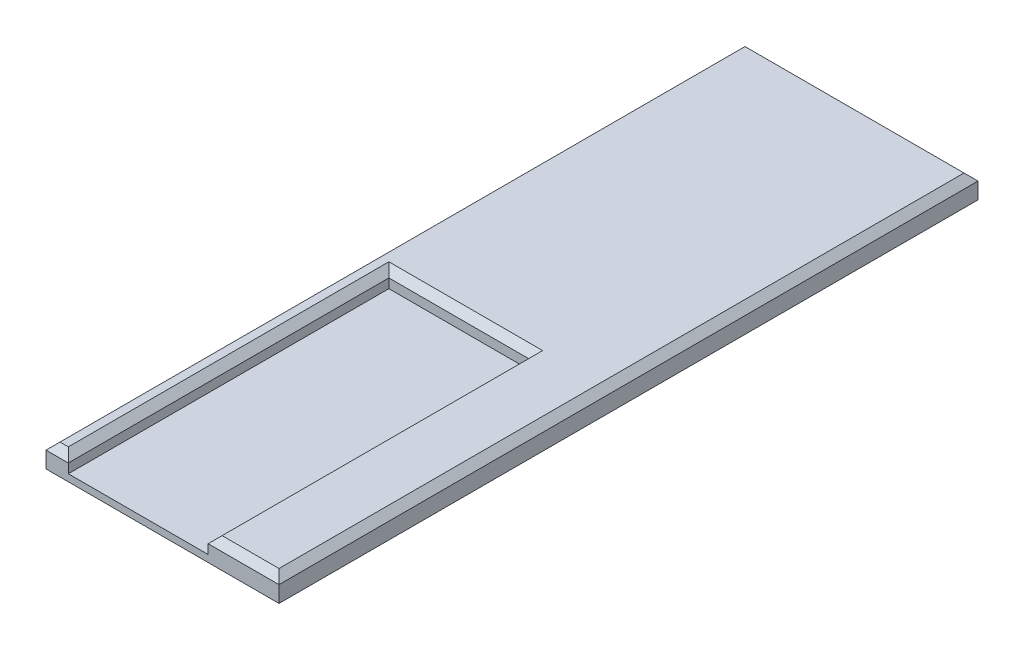
ISO-10303-21;
HEADER;
FILE_DESCRIPTION(('STEP AP214'),'2;1');
FILE_NAME('part.step','',(''),(''),'','','');
FILE_SCHEMA(('AUTOMOTIVE_DESIGN { 1 0 10303 214 1 1 1 1 }'));
ENDSEC;
DATA;
#1=APPLICATION_CONTEXT('core data for automotive mechanical design processes');
#2=APPLICATION_PROTOCOL_DEFINITION('international standard','automotive_design',2000,#1);
#3=PRODUCT_CONTEXT('',#1,'mechanical');
#4=PRODUCT('Part','Part','',(#3));
#5=PRODUCT_RELATED_PRODUCT_CATEGORY('part','',(#4));
#6=PRODUCT_DEFINITION_FORMATION('','',#4);
#7=PRODUCT_DEFINITION_CONTEXT('part definition',#1,'design');
#8=PRODUCT_DEFINITION('design','',#6,#7);
#9=PRODUCT_DEFINITION_SHAPE('','',#8);
#10=(LENGTH_UNIT() NAMED_UNIT(*) SI_UNIT(.MILLI.,.METRE.));
#11=(NAMED_UNIT(*) PLANE_ANGLE_UNIT() SI_UNIT($,.RADIAN.));
#12=(NAMED_UNIT(*) SI_UNIT($,.STERADIAN.) SOLID_ANGLE_UNIT());
#13=UNCERTAINTY_MEASURE_WITH_UNIT(LENGTH_MEASURE(1.E-05),#10,'distance_accuracy_value','');
#14=(GEOMETRIC_REPRESENTATION_CONTEXT(3) GLOBAL_UNCERTAINTY_ASSIGNED_CONTEXT((#13)) GLOBAL_UNIT_ASSIGNED_CONTEXT((#10,
#11,#12)) REPRESENTATION_CONTEXT('',''));
#15=CARTESIAN_POINT('',(0.,0.,0.));
#16=DIRECTION('',(0.,0.,1.));
#17=DIRECTION('',(1.,0.,0.));
#18=AXIS2_PLACEMENT_3D('',#15,#16,#17);
#19=CARTESIAN_POINT('',(-50.,-10.,150.));
#20=DIRECTION('',(-1.,0.,0.));
#21=DIRECTION('',(0.,0.,1.));
#22=AXIS2_PLACEMENT_3D('',#19,#20,#21);
#23=PLANE('',#22);
#24=DIRECTION('',(0.,1.,0.));
#25=VECTOR('',#24,1.);
#26=CARTESIAN_POINT('',(-50.,-10.,150.));
#27=LINE('',#26,#25);
#28=CARTESIAN_POINT('',(-50.,-10.,150.));
#29=VERTEX_POINT('',#28);
#30=CARTESIAN_POINT('',(-50.,-3.,150.));
#31=VERTEX_POINT('',#30);
#32=EDGE_CURVE('E172',#29,#31,#27,.T.);
#33=ORIENTED_EDGE('',*,*,#32,.T.);
#34=DIRECTION('',(0.,0.,-1.));
#35=VECTOR('',#34,1.);
#36=CARTESIAN_POINT('',(-50.,-3.,150.));
#37=LINE('',#36,#35);
#38=CARTESIAN_POINT('',(-50.,-3.,-150.));
#39=VERTEX_POINT('',#38);
#40=EDGE_CURVE('E46',#31,#39,#37,.T.);
#41=ORIENTED_EDGE('',*,*,#40,.T.);
#42=DIRECTION('',(0.,1.,0.));
#43=VECTOR('',#42,1.);
#44=CARTESIAN_POINT('',(-50.,-10.,-150.));
#45=LINE('',#44,#43);
#46=CARTESIAN_POINT('',(-50.,-10.,-150.));
#47=VERTEX_POINT('',#46);
#48=EDGE_CURVE('E173',#47,#39,#45,.T.);
#49=ORIENTED_EDGE('',*,*,#48,.F.);
#50=DIRECTION('',(0.,0.,1.));
#51=VECTOR('',#50,1.);
#52=CARTESIAN_POINT('',(-50.,-10.,150.));
#53=LINE('',#52,#51);
#54=EDGE_CURVE('E159',#47,#29,#53,.T.);
#55=ORIENTED_EDGE('',*,*,#54,.T.);
#56=EDGE_LOOP('',(#33,#41,#49,#55));
#57=FACE_BOUND('',#56,.T.);
#58=ADVANCED_FACE('F36',(#57),#23,.T.);
#59=CARTESIAN_POINT('',(50.,-10.,-150.));
#60=DIRECTION('',(0.,0.,-1.));
#61=DIRECTION('',(-1.,0.,0.));
#62=AXIS2_PLACEMENT_3D('',#59,#60,#61);
#63=PLANE('',#62);
#64=ORIENTED_EDGE('',*,*,#48,.T.);
#65=DIRECTION('',(1.,0.,0.));
#66=VECTOR('',#65,1.);
#67=CARTESIAN_POINT('',(50.,-3.,-150.));
#68=LINE('',#67,#66);
#69=CARTESIAN_POINT('',(50.,-3.,-150.));
#70=VERTEX_POINT('',#69);
#71=EDGE_CURVE('E11',#39,#70,#68,.T.);
#72=ORIENTED_EDGE('',*,*,#71,.T.);
#73=DIRECTION('',(0.,1.,0.));
#74=VECTOR('',#73,1.);
#75=CARTESIAN_POINT('',(50.,-10.,-150.));
#76=LINE('',#75,#74);
#77=CARTESIAN_POINT('',(50.,-10.,-150.));
#78=VERTEX_POINT('',#77);
#79=EDGE_CURVE('E176',#78,#70,#76,.T.);
#80=ORIENTED_EDGE('',*,*,#79,.F.);
#81=DIRECTION('',(-1.,0.,0.));
#82=VECTOR('',#81,1.);
#83=CARTESIAN_POINT('',(50.,-10.,-150.));
#84=LINE('',#83,#82);
#85=EDGE_CURVE('E169',#78,#47,#84,.T.);
#86=ORIENTED_EDGE('',*,*,#85,.T.);
#87=EDGE_LOOP('',(#64,#72,#80,#86));
#88=FACE_BOUND('',#87,.T.);
#89=ADVANCED_FACE('F255',(#88),#63,.T.);
#90=CARTESIAN_POINT('',(50.,-10.,150.));
#91=DIRECTION('',(1.,0.,0.));
#92=DIRECTION('',(0.,0.,-1.));
#93=AXIS2_PLACEMENT_3D('',#90,#91,#92);
#94=PLANE('',#93);
#95=ORIENTED_EDGE('',*,*,#79,.T.);
#96=DIRECTION('',(0.,0.,1.));
#97=VECTOR('',#96,1.);
#98=CARTESIAN_POINT('',(50.,-3.,150.));
#99=LINE('',#98,#97);
#100=CARTESIAN_POINT('',(50.,-3.,150.));
#101=VERTEX_POINT('',#100);
#102=EDGE_CURVE('E198',#70,#101,#99,.T.);
#103=ORIENTED_EDGE('',*,*,#102,.T.);
#104=DIRECTION('',(0.,1.,0.));
#105=VECTOR('',#104,1.);
#106=CARTESIAN_POINT('',(50.,-10.,150.));
#107=LINE('',#106,#105);
#108=CARTESIAN_POINT('',(50.,-10.,150.));
#109=VERTEX_POINT('',#108);
#110=EDGE_CURVE('E179',#109,#101,#107,.T.);
#111=ORIENTED_EDGE('',*,*,#110,.F.);
#112=DIRECTION('',(0.,0.,-1.));
#113=VECTOR('',#112,1.);
#114=CARTESIAN_POINT('',(50.,-10.,150.));
#115=LINE('',#114,#113);
#116=EDGE_CURVE('E166',#109,#78,#115,.T.);
#117=ORIENTED_EDGE('',*,*,#116,.T.);
#118=EDGE_LOOP('',(#95,#103,#111,#117));
#119=FACE_BOUND('',#118,.T.);
#120=ADVANCED_FACE('F260',(#119),#94,.T.);
#121=CARTESIAN_POINT('',(50.,-10.,150.));
#122=DIRECTION('',(0.,0.,1.));
#123=DIRECTION('',(1.,0.,0.));
#124=AXIS2_PLACEMENT_3D('',#121,#122,#123);
#125=PLANE('',#124);
#126=ORIENTED_EDGE('',*,*,#110,.T.);
#127=DIRECTION('',(-1.,0.,0.));
#128=VECTOR('',#127,1.);
#129=CARTESIAN_POINT('',(50.,-3.,150.));
#130=LINE('',#129,#128);
#131=CARTESIAN_POINT('',(19.5825318432793,-3.,150.));
#132=VERTEX_POINT('',#131);
#133=EDGE_CURVE('E152',#101,#132,#130,.T.);
#134=ORIENTED_EDGE('',*,*,#133,.T.);
#135=DIRECTION('',(0.,1.,0.));
#136=VECTOR('',#135,1.);
#137=CARTESIAN_POINT('',(19.5825318432793,-7.,150.));
#138=LINE('',#137,#136);
#139=CARTESIAN_POINT('',(19.5825318432793,-7.,150.));
#140=VERTEX_POINT('',#139);
#141=EDGE_CURVE('E132',#140,#132,#138,.T.);
#142=ORIENTED_EDGE('',*,*,#141,.F.);
#143=DIRECTION('',(1.,0.,0.));
#144=VECTOR('',#143,1.);
#145=CARTESIAN_POINT('',(19.5825318432793,-7.,150.));
#146=LINE('',#145,#144);
#147=CARTESIAN_POINT('',(-40.4174681567207,-7.,150.));
#148=VERTEX_POINT('',#147);
#149=EDGE_CURVE('E139',#148,#140,#146,.T.);
#150=ORIENTED_EDGE('',*,*,#149,.F.);
#151=DIRECTION('',(0.,1.,0.));
#152=VECTOR('',#151,1.);
#153=CARTESIAN_POINT('',(-40.4174681567207,-7.,150.));
#154=LINE('',#153,#152);
#155=CARTESIAN_POINT('',(-40.4174681567207,-3.,150.));
#156=VERTEX_POINT('',#155);
#157=EDGE_CURVE('E163',#148,#156,#154,.T.);
#158=ORIENTED_EDGE('',*,*,#157,.T.);
#159=DIRECTION('',(-1.,0.,0.));
#160=VECTOR('',#159,1.);
#161=CARTESIAN_POINT('',(50.,-3.,150.));
#162=LINE('',#161,#160);
#163=EDGE_CURVE('E201',#156,#31,#162,.T.);
#164=ORIENTED_EDGE('',*,*,#163,.T.);
#165=ORIENTED_EDGE('',*,*,#32,.F.);
#166=DIRECTION('',(1.,0.,0.));
#167=VECTOR('',#166,1.);
#168=CARTESIAN_POINT('',(50.,-10.,150.));
#169=LINE('',#168,#167);
#170=EDGE_CURVE('E162',#29,#109,#169,.T.);
#171=ORIENTED_EDGE('',*,*,#170,.T.);
#172=EDGE_LOOP('',(#126,#134,#142,#150,#158,#164,#165,#171));
#173=FACE_BOUND('',#172,.T.);
#174=ADVANCED_FACE('F150',(#173),#125,.T.);
#175=CARTESIAN_POINT('',(0.,-10.,0.));
#176=DIRECTION('',(0.,1.,0.));
#177=DIRECTION('',(0.,0.,1.));
#178=AXIS2_PLACEMENT_3D('',#175,#176,#177);
#179=PLANE('',#178);
#180=ORIENTED_EDGE('',*,*,#54,.F.);
#181=ORIENTED_EDGE('',*,*,#85,.F.);
#182=ORIENTED_EDGE('',*,*,#116,.F.);
#183=ORIENTED_EDGE('',*,*,#170,.F.);
#184=EDGE_LOOP('',(#180,#181,#182,#183));
#185=FACE_BOUND('',#184,.T.);
#186=ADVANCED_FACE('F389',(#185),#179,.F.);
#187=CARTESIAN_POINT('',(0.,0.,0.));
#188=DIRECTION('',(0.,1.,0.));
#189=DIRECTION('',(0.,0.,1.));
#190=AXIS2_PLACEMENT_3D('',#187,#188,#189);
#191=PLANE('',#190);
#192=DIRECTION('',(1.,0.,0.));
#193=VECTOR('',#192,1.);
#194=CARTESIAN_POINT('',(0.,0.,147.));
#195=LINE('',#194,#193);
#196=CARTESIAN_POINT('',(22.5825318432793,0.,147.));
#197=VERTEX_POINT('',#196);
#198=CARTESIAN_POINT('',(47.,0.,147.));
#199=VERTEX_POINT('',#198);
#200=EDGE_CURVE('E193',#197,#199,#195,.T.);
#201=ORIENTED_EDGE('',*,*,#200,.T.);
#202=DIRECTION('',(0.,0.,-1.));
#203=VECTOR('',#202,1.);
#204=CARTESIAN_POINT('',(47.,0.,0.));
#205=LINE('',#204,#203);
#206=CARTESIAN_POINT('',(47.,0.,-147.));
#207=VERTEX_POINT('',#206);
#208=EDGE_CURVE('E195',#199,#207,#205,.T.);
#209=ORIENTED_EDGE('',*,*,#208,.T.);
#210=DIRECTION('',(-1.,0.,0.));
#211=VECTOR('',#210,1.);
#212=CARTESIAN_POINT('',(0.,0.,-147.));
#213=LINE('',#212,#211);
#214=CARTESIAN_POINT('',(-47.,0.,-147.));
#215=VERTEX_POINT('',#214);
#216=EDGE_CURVE('E175',#207,#215,#213,.T.);
#217=ORIENTED_EDGE('',*,*,#216,.T.);
#218=DIRECTION('',(0.,0.,1.));
#219=VECTOR('',#218,1.);
#220=CARTESIAN_POINT('',(-47.,0.,0.));
#221=LINE('',#220,#219);
#222=CARTESIAN_POINT('',(-47.,0.,147.));
#223=VERTEX_POINT('',#222);
#224=EDGE_CURVE('E183',#215,#223,#221,.T.);
#225=ORIENTED_EDGE('',*,*,#224,.T.);
#226=DIRECTION('',(1.,0.,0.));
#227=VECTOR('',#226,1.);
#228=CARTESIAN_POINT('',(0.,0.,147.));
#229=LINE('',#228,#227);
#230=CARTESIAN_POINT('',(-43.4174681567207,0.,147.));
#231=VERTEX_POINT('',#230);
#232=EDGE_CURVE('E185',#223,#231,#229,.T.);
#233=ORIENTED_EDGE('',*,*,#232,.T.);
#234=DIRECTION('',(0.,0.,-1.));
#235=VECTOR('',#234,1.);
#236=CARTESIAN_POINT('',(-43.4174681567207,0.,12.4282527532102));
#237=LINE('',#236,#235);
#238=CARTESIAN_POINT('',(-43.4174681567207,0.,9.42825275321024));
#239=VERTEX_POINT('',#238);
#240=EDGE_CURVE('E187',#231,#239,#237,.T.);
#241=ORIENTED_EDGE('',*,*,#240,.T.);
#242=DIRECTION('',(1.,0.,0.));
#243=VECTOR('',#242,1.);
#244=CARTESIAN_POINT('',(19.5825318432793,0.,9.42825275321024));
#245=LINE('',#244,#243);
#246=CARTESIAN_POINT('',(22.5825318432793,0.,9.42825275321024));
#247=VERTEX_POINT('',#246);
#248=EDGE_CURVE('E189',#239,#247,#245,.T.);
#249=ORIENTED_EDGE('',*,*,#248,.T.);
#250=DIRECTION('',(0.,0.,1.));
#251=VECTOR('',#250,1.);
#252=CARTESIAN_POINT('',(22.5825318432793,0.,150.));
#253=LINE('',#252,#251);
#254=EDGE_CURVE('E191',#247,#197,#253,.T.);
#255=ORIENTED_EDGE('',*,*,#254,.T.);
#256=EDGE_LOOP('',(#201,#209,#217,#225,#233,#241,#249,#255));
#257=FACE_BOUND('',#256,.T.);
#258=ADVANCED_FACE('F252',(#257),#191,.T.);
#259=CARTESIAN_POINT('',(-40.4174681567207,-7.,150.));
#260=DIRECTION('',(-1.,0.,0.));
#261=DIRECTION('',(0.,0.,1.));
#262=AXIS2_PLACEMENT_3D('',#259,#260,#261);
#263=PLANE('',#262);
#264=DIRECTION('',(0.,1.,0.));
#265=VECTOR('',#264,1.);
#266=CARTESIAN_POINT('',(-40.4174681567207,-7.,12.4282527532102));
#267=LINE('',#266,#265);
#268=CARTESIAN_POINT('',(-40.4174681567207,-7.,12.4282527532102));
#269=VERTEX_POINT('',#268);
#270=CARTESIAN_POINT('',(-40.4174681567207,-3.,12.4282527532102));
#271=VERTEX_POINT('',#270);
#272=EDGE_CURVE('E154',#269,#271,#267,.T.);
#273=ORIENTED_EDGE('',*,*,#272,.T.);
#274=DIRECTION('',(0.,0.,1.));
#275=VECTOR('',#274,1.);
#276=CARTESIAN_POINT('',(-40.4174681567207,-3.,150.));
#277=LINE('',#276,#275);
#278=EDGE_CURVE('E207',#271,#156,#277,.T.);
#279=ORIENTED_EDGE('',*,*,#278,.T.);
#280=ORIENTED_EDGE('',*,*,#157,.F.);
#281=DIRECTION('',(0.,0.,1.));
#282=VECTOR('',#281,1.);
#283=CARTESIAN_POINT('',(-40.4174681567207,-7.,150.));
#284=LINE('',#283,#282);
#285=EDGE_CURVE('E145',#269,#148,#284,.T.);
#286=ORIENTED_EDGE('',*,*,#285,.F.);
#287=EDGE_LOOP('',(#273,#279,#280,#286));
#288=FACE_BOUND('',#287,.T.);
#289=ADVANCED_FACE('F241',(#288),#263,.F.);
#290=CARTESIAN_POINT('',(-40.4174681567207,-7.,12.4282527532102));
#291=DIRECTION('',(0.,0.,-1.));
#292=DIRECTION('',(-1.,0.,0.));
#293=AXIS2_PLACEMENT_3D('',#290,#291,#292);
#294=PLANE('',#293);
#295=DIRECTION('',(0.,1.,0.));
#296=VECTOR('',#295,1.);
#297=CARTESIAN_POINT('',(19.5825318432793,-7.,12.4282527532102));
#298=LINE('',#297,#296);
#299=CARTESIAN_POINT('',(19.5825318432793,-7.,12.4282527532102));
#300=VERTEX_POINT('',#299);
#301=CARTESIAN_POINT('',(19.5825318432793,-3.,12.4282527532102));
#302=VERTEX_POINT('',#301);
#303=EDGE_CURVE('E134',#300,#302,#298,.T.);
#304=ORIENTED_EDGE('',*,*,#303,.T.);
#305=DIRECTION('',(-1.,0.,0.));
#306=VECTOR('',#305,1.);
#307=CARTESIAN_POINT('',(-40.4174681567207,-3.,12.4282527532102));
#308=LINE('',#307,#306);
#309=EDGE_CURVE('E61',#302,#271,#308,.T.);
#310=ORIENTED_EDGE('',*,*,#309,.T.);
#311=ORIENTED_EDGE('',*,*,#272,.F.);
#312=DIRECTION('',(-1.,0.,0.));
#313=VECTOR('',#312,1.);
#314=CARTESIAN_POINT('',(-40.4174681567207,-7.,12.4282527532102));
#315=LINE('',#314,#313);
#316=EDGE_CURVE('E138',#300,#269,#315,.T.);
#317=ORIENTED_EDGE('',*,*,#316,.F.);
#318=EDGE_LOOP('',(#304,#310,#311,#317));
#319=FACE_BOUND('',#318,.T.);
#320=ADVANCED_FACE('F244',(#319),#294,.F.);
#321=CARTESIAN_POINT('',(19.5825318432793,-7.,12.4282527532102));
#322=DIRECTION('',(1.,0.,0.));
#323=DIRECTION('',(0.,0.,-1.));
#324=AXIS2_PLACEMENT_3D('',#321,#322,#323);
#325=PLANE('',#324);
#326=ORIENTED_EDGE('',*,*,#141,.T.);
#327=DIRECTION('',(0.,0.,-1.));
#328=VECTOR('',#327,1.);
#329=CARTESIAN_POINT('',(19.5825318432793,-3.,12.4282527532102));
#330=LINE('',#329,#328);
#331=EDGE_CURVE('E204',#132,#302,#330,.T.);
#332=ORIENTED_EDGE('',*,*,#331,.T.);
#333=ORIENTED_EDGE('',*,*,#303,.F.);
#334=DIRECTION('',(0.,0.,-1.));
#335=VECTOR('',#334,1.);
#336=CARTESIAN_POINT('',(19.5825318432793,-7.,12.4282527532102));
#337=LINE('',#336,#335);
#338=EDGE_CURVE('E128',#140,#300,#337,.T.);
#339=ORIENTED_EDGE('',*,*,#338,.F.);
#340=EDGE_LOOP('',(#326,#332,#333,#339));
#341=FACE_BOUND('',#340,.T.);
#342=ADVANCED_FACE('F130',(#341),#325,.F.);
#343=CARTESIAN_POINT('',(0.,-7.,0.));
#344=DIRECTION('',(0.,-1.,0.));
#345=DIRECTION('',(0.,0.,-1.));
#346=AXIS2_PLACEMENT_3D('',#343,#344,#345);
#347=PLANE('',#346);
#348=ORIENTED_EDGE('',*,*,#149,.T.);
#349=ORIENTED_EDGE('',*,*,#338,.T.);
#350=ORIENTED_EDGE('',*,*,#316,.T.);
#351=ORIENTED_EDGE('',*,*,#285,.T.);
#352=EDGE_LOOP('',(#348,#349,#350,#351));
#353=FACE_BOUND('',#352,.T.);
#354=ADVANCED_FACE('F143',(#353),#347,.F.);
#355=CARTESIAN_POINT('',(-40.4174681567207,-3.,150.));
#356=DIRECTION('',(0.707106781186547,0.707106781186547,0.));
#357=DIRECTION('',(0.,0.,-1.));
#358=AXIS2_PLACEMENT_3D('',#355,#356,#357);
#359=PLANE('',#358);
#360=DIRECTION('',(0.577350269189626,-0.577350269189626,0.577350269189626));
#361=VECTOR('',#360,1.);
#362=CARTESIAN_POINT('',(-28.9449787711471,-14.4724893855736,161.472489385574));
#363=LINE('',#362,#361);
#364=EDGE_CURVE('E225',#156,#231,#363,.F.);
#365=ORIENTED_EDGE('',*,*,#364,.F.);
#366=ORIENTED_EDGE('',*,*,#278,.F.);
#367=DIRECTION('',(-0.577350269189626,0.577350269189626,-0.577350269189626));
#368=VECTOR('',#367,1.);
#369=CARTESIAN_POINT('',(-40.4174681567207,-3.,12.4282527532102));
#370=LINE('',#369,#368);
#371=EDGE_CURVE('E41',#239,#271,#370,.F.);
#372=ORIENTED_EDGE('',*,*,#371,.F.);
#373=ORIENTED_EDGE('',*,*,#240,.F.);
#374=EDGE_LOOP('',(#365,#366,#372,#373));
#375=FACE_BOUND('',#374,.T.);
#376=ADVANCED_FACE('F39',(#375),#359,.T.);
#377=CARTESIAN_POINT('',(-40.4174681567207,-3.,12.4282527532102));
#378=DIRECTION('',(0.,0.707106781186547,0.707106781186547));
#379=DIRECTION('',(1.,0.,0.));
#380=AXIS2_PLACEMENT_3D('',#377,#378,#379);
#381=PLANE('',#380);
#382=ORIENTED_EDGE('',*,*,#371,.T.);
#383=ORIENTED_EDGE('',*,*,#309,.F.);
#384=DIRECTION('',(0.577350269189626,0.577350269189626,-0.577350269189626));
#385=VECTOR('',#384,1.);
#386=CARTESIAN_POINT('',(19.5825318432793,-3.,12.4282527532102));
#387=LINE('',#386,#385);
#388=EDGE_CURVE('E223',#247,#302,#387,.F.);
#389=ORIENTED_EDGE('',*,*,#388,.F.);
#390=ORIENTED_EDGE('',*,*,#248,.F.);
#391=EDGE_LOOP('',(#382,#383,#389,#390));
#392=FACE_BOUND('',#391,.T.);
#393=ADVANCED_FACE('F235',(#392),#381,.T.);
#394=CARTESIAN_POINT('',(0.,0.,147.));
#395=DIRECTION('',(0.,-0.707106781186547,-0.707106781186547));
#396=DIRECTION('',(1.,0.,0.));
#397=AXIS2_PLACEMENT_3D('',#394,#395,#396);
#398=PLANE('',#397);
#399=ORIENTED_EDGE('',*,*,#364,.T.);
#400=ORIENTED_EDGE('',*,*,#232,.F.);
#401=DIRECTION('',(0.577350269189626,0.577350269189626,-0.577350269189626));
#402=VECTOR('',#401,1.);
#403=CARTESIAN_POINT('',(2.00000000000004,49.,98.));
#404=LINE('',#403,#402);
#405=EDGE_CURVE('E220',#31,#223,#404,.T.);
#406=ORIENTED_EDGE('',*,*,#405,.F.);
#407=ORIENTED_EDGE('',*,*,#163,.F.);
#408=EDGE_LOOP('',(#399,#400,#406,#407));
#409=FACE_BOUND('',#408,.T.);
#410=ADVANCED_FACE('F301',(#409),#398,.F.);
#411=CARTESIAN_POINT('',(19.5825318432793,-3.,12.4282527532102));
#412=DIRECTION('',(-0.707106781186547,0.707106781186548,0.));
#413=DIRECTION('',(0.,0.,1.));
#414=AXIS2_PLACEMENT_3D('',#411,#412,#413);
#415=PLANE('',#414);
#416=ORIENTED_EDGE('',*,*,#388,.T.);
#417=ORIENTED_EDGE('',*,*,#331,.F.);
#418=DIRECTION('',(-0.577350269189626,-0.577350269189626,0.577350269189626));
#419=VECTOR('',#418,1.);
#420=CARTESIAN_POINT('',(65.4397809255426,42.8572490822632,104.142750917737));
#421=LINE('',#420,#419);
#422=EDGE_CURVE('E217',#197,#132,#421,.T.);
#423=ORIENTED_EDGE('',*,*,#422,.F.);
#424=ORIENTED_EDGE('',*,*,#254,.F.);
#425=EDGE_LOOP('',(#416,#417,#423,#424));
#426=FACE_BOUND('',#425,.T.);
#427=ADVANCED_FACE('F294',(#426),#415,.T.);
#428=CARTESIAN_POINT('',(-47.,0.,0.));
#429=DIRECTION('',(0.707106781186547,-0.707106781186547,0.));
#430=DIRECTION('',(0.,0.,1.));
#431=AXIS2_PLACEMENT_3D('',#428,#429,#430);
#432=PLANE('',#431);
#433=ORIENTED_EDGE('',*,*,#405,.T.);
#434=ORIENTED_EDGE('',*,*,#224,.F.);
#435=DIRECTION('',(0.577350269189626,0.577350269189626,0.577350269189626));
#436=VECTOR('',#435,1.);
#437=CARTESIAN_POINT('',(-31.3333333333333,15.6666666666667,-131.333333333333));
#438=LINE('',#437,#436);
#439=EDGE_CURVE('E214',#39,#215,#438,.T.);
#440=ORIENTED_EDGE('',*,*,#439,.F.);
#441=ORIENTED_EDGE('',*,*,#40,.F.);
#442=EDGE_LOOP('',(#433,#434,#440,#441));
#443=FACE_BOUND('',#442,.T.);
#444=ADVANCED_FACE('F287',(#443),#432,.F.);
#445=CARTESIAN_POINT('',(0.,0.,147.));
#446=DIRECTION('',(0.,-0.707106781186547,-0.707106781186547));
#447=DIRECTION('',(1.,0.,0.));
#448=AXIS2_PLACEMENT_3D('',#445,#446,#447);
#449=PLANE('',#448);
#450=ORIENTED_EDGE('',*,*,#422,.T.);
#451=ORIENTED_EDGE('',*,*,#133,.F.);
#452=DIRECTION('',(-0.577350269189626,0.577350269189626,-0.577350269189626));
#453=VECTOR('',#452,1.);
#454=CARTESIAN_POINT('',(31.3333333333334,15.6666666666667,131.333333333333));
#455=LINE('',#454,#453);
#456=EDGE_CURVE('E212',#199,#101,#455,.F.);
#457=ORIENTED_EDGE('',*,*,#456,.F.);
#458=ORIENTED_EDGE('',*,*,#200,.F.);
#459=EDGE_LOOP('',(#450,#451,#457,#458));
#460=FACE_BOUND('',#459,.T.);
#461=ADVANCED_FACE('F280',(#460),#449,.F.);
#462=CARTESIAN_POINT('',(0.,0.,-147.));
#463=DIRECTION('',(0.,-0.707106781186547,0.707106781186547));
#464=DIRECTION('',(-1.,0.,0.));
#465=AXIS2_PLACEMENT_3D('',#462,#463,#464);
#466=PLANE('',#465);
#467=ORIENTED_EDGE('',*,*,#439,.T.);
#468=ORIENTED_EDGE('',*,*,#216,.F.);
#469=DIRECTION('',(0.577350269189626,-0.577350269189626,-0.577350269189626));
#470=VECTOR('',#469,1.);
#471=CARTESIAN_POINT('',(31.3333333333334,15.6666666666667,-131.333333333333));
#472=LINE('',#471,#470);
#473=EDGE_CURVE('E210',#70,#207,#472,.F.);
#474=ORIENTED_EDGE('',*,*,#473,.F.);
#475=ORIENTED_EDGE('',*,*,#71,.F.);
#476=EDGE_LOOP('',(#467,#468,#474,#475));
#477=FACE_BOUND('',#476,.T.);
#478=ADVANCED_FACE('F273',(#477),#466,.F.);
#479=CARTESIAN_POINT('',(47.,0.,0.));
#480=DIRECTION('',(-0.707106781186547,-0.707106781186547,0.));
#481=DIRECTION('',(0.,0.,-1.));
#482=AXIS2_PLACEMENT_3D('',#479,#480,#481);
#483=PLANE('',#482);
#484=ORIENTED_EDGE('',*,*,#456,.T.);
#485=ORIENTED_EDGE('',*,*,#102,.F.);
#486=ORIENTED_EDGE('',*,*,#473,.T.);
#487=ORIENTED_EDGE('',*,*,#208,.F.);
#488=EDGE_LOOP('',(#484,#485,#486,#487));
#489=FACE_BOUND('',#488,.T.);
#490=ADVANCED_FACE('F267',(#489),#483,.F.);
#491=CLOSED_SHELL('',(#58,#89,#120,#174,#186,#258,#289,#320,#342,#354,#376,#393,#410,#427,#444,
#461,#478,#490));
#492=MANIFOLD_SOLID_BREP('B2',#491);
#493=ADVANCED_BREP_SHAPE_REPRESENTATION('',(#18,#492),#14);
#494=SHAPE_DEFINITION_REPRESENTATION(#9,#493);
ENDSEC;
END-ISO-10303-21;
